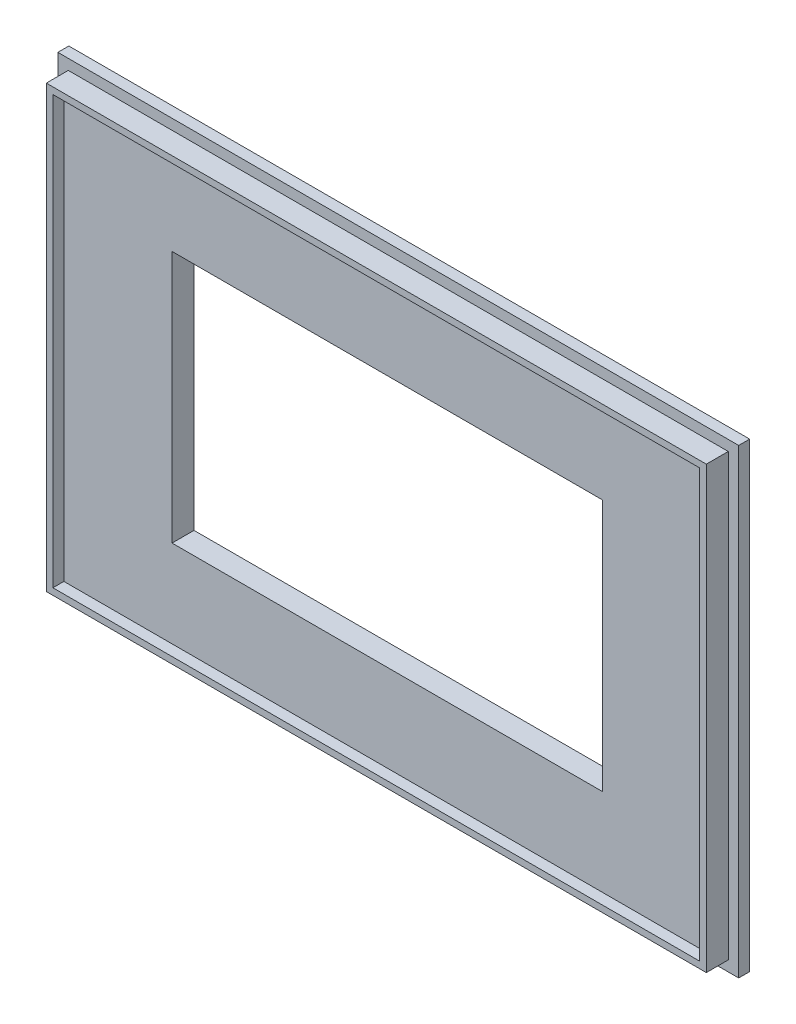
ISO-10303-21;
HEADER;
FILE_DESCRIPTION(('STEP AP214'),'2;1');
FILE_NAME('part.step','',(''),(''),'','','');
FILE_SCHEMA(('AUTOMOTIVE_DESIGN { 1 0 10303 214 1 1 1 1 }'));
ENDSEC;
DATA;
#1=APPLICATION_CONTEXT('core data for automotive mechanical design processes');
#2=APPLICATION_PROTOCOL_DEFINITION('international standard','automotive_design',2000,#1);
#3=PRODUCT_CONTEXT('',#1,'mechanical');
#4=PRODUCT('Part','Part','',(#3));
#5=PRODUCT_RELATED_PRODUCT_CATEGORY('part','',(#4));
#6=PRODUCT_DEFINITION_FORMATION('','',#4);
#7=PRODUCT_DEFINITION_CONTEXT('part definition',#1,'design');
#8=PRODUCT_DEFINITION('design','',#6,#7);
#9=PRODUCT_DEFINITION_SHAPE('','',#8);
#10=(LENGTH_UNIT() NAMED_UNIT(*) SI_UNIT(.MILLI.,.METRE.));
#11=(NAMED_UNIT(*) PLANE_ANGLE_UNIT() SI_UNIT($,.RADIAN.));
#12=(NAMED_UNIT(*) SI_UNIT($,.STERADIAN.) SOLID_ANGLE_UNIT());
#13=UNCERTAINTY_MEASURE_WITH_UNIT(LENGTH_MEASURE(1.E-05),#10,'distance_accuracy_value','');
#14=(GEOMETRIC_REPRESENTATION_CONTEXT(3) GLOBAL_UNCERTAINTY_ASSIGNED_CONTEXT((#13)) GLOBAL_UNIT_ASSIGNED_CONTEXT((#10,
#11,#12)) REPRESENTATION_CONTEXT('',''));
#15=CARTESIAN_POINT('',(0.,0.,0.));
#16=DIRECTION('',(0.,0.,1.));
#17=DIRECTION('',(1.,0.,0.));
#18=AXIS2_PLACEMENT_3D('',#15,#16,#17);
#19=CARTESIAN_POINT('',(0.,0.,5.08));
#20=DIRECTION('',(0.,0.,-1.));
#21=DIRECTION('',(-1.,0.,0.));
#22=AXIS2_PLACEMENT_3D('',#19,#20,#21);
#23=PLANE('',#22);
#24=DIRECTION('',(0.,1.,0.));
#25=VECTOR('',#24,1.);
#26=CARTESIAN_POINT('',(74.803,-49.403,5.08));
#27=LINE('',#26,#25);
#28=CARTESIAN_POINT('',(74.803,-49.403,5.08));
#29=VERTEX_POINT('',#28);
#30=CARTESIAN_POINT('',(74.803,49.403,5.08));
#31=VERTEX_POINT('',#30);
#32=EDGE_CURVE('E190',#29,#31,#27,.T.);
#33=ORIENTED_EDGE('',*,*,#32,.T.);
#34=DIRECTION('',(-1.,0.,0.));
#35=VECTOR('',#34,1.);
#36=CARTESIAN_POINT('',(-74.803,49.403,5.08));
#37=LINE('',#36,#35);
#38=CARTESIAN_POINT('',(-74.803,49.403,5.08));
#39=VERTEX_POINT('',#38);
#40=EDGE_CURVE('E193',#31,#39,#37,.T.);
#41=ORIENTED_EDGE('',*,*,#40,.T.);
#42=DIRECTION('',(0.,-1.,0.));
#43=VECTOR('',#42,1.);
#44=CARTESIAN_POINT('',(-74.803,-49.403,5.08));
#45=LINE('',#44,#43);
#46=CARTESIAN_POINT('',(-74.803,-49.403,5.08));
#47=VERTEX_POINT('',#46);
#48=EDGE_CURVE('E197',#39,#47,#45,.T.);
#49=ORIENTED_EDGE('',*,*,#48,.T.);
#50=DIRECTION('',(1.,0.,0.));
#51=VECTOR('',#50,1.);
#52=CARTESIAN_POINT('',(-74.803,-49.403,5.08));
#53=LINE('',#52,#51);
#54=EDGE_CURVE('E200',#47,#29,#53,.T.);
#55=ORIENTED_EDGE('',*,*,#54,.T.);
#56=EDGE_LOOP('',(#33,#41,#49,#55));
#57=FACE_BOUND('',#56,.T.);
#58=DIRECTION('',(0.,1.,0.));
#59=VECTOR('',#58,1.);
#60=CARTESIAN_POINT('',(49.784,-29.21,5.08));
#61=LINE('',#60,#59);
#62=CARTESIAN_POINT('',(49.784,-29.21,5.08));
#63=VERTEX_POINT('',#62);
#64=CARTESIAN_POINT('',(49.784,29.21,5.08));
#65=VERTEX_POINT('',#64);
#66=EDGE_CURVE('E158',#63,#65,#61,.T.);
#67=ORIENTED_EDGE('',*,*,#66,.F.);
#68=DIRECTION('',(1.,0.,0.));
#69=VECTOR('',#68,1.);
#70=CARTESIAN_POINT('',(-49.784,-29.21,5.08));
#71=LINE('',#70,#69);
#72=CARTESIAN_POINT('',(-49.784,-29.21,5.08));
#73=VERTEX_POINT('',#72);
#74=EDGE_CURVE('E173',#73,#63,#71,.T.);
#75=ORIENTED_EDGE('',*,*,#74,.F.);
#76=DIRECTION('',(0.,-1.,0.));
#77=VECTOR('',#76,1.);
#78=CARTESIAN_POINT('',(-49.784,-29.21,5.08));
#79=LINE('',#78,#77);
#80=CARTESIAN_POINT('',(-49.784,29.21,5.08));
#81=VERTEX_POINT('',#80);
#82=EDGE_CURVE('E54',#81,#73,#79,.T.);
#83=ORIENTED_EDGE('',*,*,#82,.F.);
#84=DIRECTION('',(-1.,0.,0.));
#85=VECTOR('',#84,1.);
#86=CARTESIAN_POINT('',(-49.784,29.21,5.08));
#87=LINE('',#86,#85);
#88=EDGE_CURVE('E181',#65,#81,#87,.T.);
#89=ORIENTED_EDGE('',*,*,#88,.F.);
#90=EDGE_LOOP('',(#67,#75,#83,#89));
#91=FACE_BOUND('',#90,.T.);
#92=ADVANCED_FACE('F39',(#57,#91),#23,.F.);
#93=CARTESIAN_POINT('',(78.74,-53.34,2.54));
#94=DIRECTION('',(-1.,0.,0.));
#95=DIRECTION('',(0.,0.,1.));
#96=AXIS2_PLACEMENT_3D('',#93,#94,#95);
#97=PLANE('',#96);
#98=DIRECTION('',(0.,1.,0.));
#99=VECTOR('',#98,1.);
#100=CARTESIAN_POINT('',(78.74,-53.34,0.));
#101=LINE('',#100,#99);
#102=CARTESIAN_POINT('',(78.74,-53.34,0.));
#103=VERTEX_POINT('',#102);
#104=CARTESIAN_POINT('',(78.74,53.34,0.));
#105=VERTEX_POINT('',#104);
#106=EDGE_CURVE('E246',#103,#105,#101,.T.);
#107=ORIENTED_EDGE('',*,*,#106,.T.);
#108=DIRECTION('',(0.,0.,-1.));
#109=VECTOR('',#108,1.);
#110=CARTESIAN_POINT('',(78.74,53.34,2.54));
#111=LINE('',#110,#109);
#112=CARTESIAN_POINT('',(78.74,53.34,2.54));
#113=VERTEX_POINT('',#112);
#114=EDGE_CURVE('E11',#113,#105,#111,.T.);
#115=ORIENTED_EDGE('',*,*,#114,.F.);
#116=DIRECTION('',(0.,1.,0.));
#117=VECTOR('',#116,1.);
#118=CARTESIAN_POINT('',(78.74,-53.34,2.54));
#119=LINE('',#118,#117);
#120=CARTESIAN_POINT('',(78.74,-53.34,2.54));
#121=VERTEX_POINT('',#120);
#122=EDGE_CURVE('E253',#121,#113,#119,.T.);
#123=ORIENTED_EDGE('',*,*,#122,.F.);
#124=DIRECTION('',(0.,0.,-1.));
#125=VECTOR('',#124,1.);
#126=CARTESIAN_POINT('',(78.74,-53.34,2.54));
#127=LINE('',#126,#125);
#128=EDGE_CURVE('E263',#121,#103,#127,.T.);
#129=ORIENTED_EDGE('',*,*,#128,.T.);
#130=EDGE_LOOP('',(#107,#115,#123,#129));
#131=FACE_BOUND('',#130,.T.);
#132=ADVANCED_FACE('F41',(#131),#97,.F.);
#133=CARTESIAN_POINT('',(-78.74,53.34,2.54));
#134=DIRECTION('',(0.,-1.,0.));
#135=DIRECTION('',(0.,0.,-1.));
#136=AXIS2_PLACEMENT_3D('',#133,#134,#135);
#137=PLANE('',#136);
#138=DIRECTION('',(-1.,0.,0.));
#139=VECTOR('',#138,1.);
#140=CARTESIAN_POINT('',(-78.74,53.34,0.));
#141=LINE('',#140,#139);
#142=CARTESIAN_POINT('',(-78.74,53.34,0.));
#143=VERTEX_POINT('',#142);
#144=EDGE_CURVE('E266',#105,#143,#141,.T.);
#145=ORIENTED_EDGE('',*,*,#144,.T.);
#146=DIRECTION('',(0.,0.,-1.));
#147=VECTOR('',#146,1.);
#148=CARTESIAN_POINT('',(-78.74,53.34,2.54));
#149=LINE('',#148,#147);
#150=CARTESIAN_POINT('',(-78.74,53.34,2.54));
#151=VERTEX_POINT('',#150);
#152=EDGE_CURVE('E47',#151,#143,#149,.T.);
#153=ORIENTED_EDGE('',*,*,#152,.F.);
#154=DIRECTION('',(-1.,0.,0.));
#155=VECTOR('',#154,1.);
#156=CARTESIAN_POINT('',(-78.74,53.34,2.54));
#157=LINE('',#156,#155);
#158=EDGE_CURVE('E256',#113,#151,#157,.T.);
#159=ORIENTED_EDGE('',*,*,#158,.F.);
#160=ORIENTED_EDGE('',*,*,#114,.T.);
#161=EDGE_LOOP('',(#145,#153,#159,#160));
#162=FACE_BOUND('',#161,.T.);
#163=ADVANCED_FACE('F294',(#162),#137,.F.);
#164=CARTESIAN_POINT('',(-78.74,-53.34,2.54));
#165=DIRECTION('',(1.,0.,0.));
#166=DIRECTION('',(0.,0.,-1.));
#167=AXIS2_PLACEMENT_3D('',#164,#165,#166);
#168=PLANE('',#167);
#169=DIRECTION('',(0.,-1.,0.));
#170=VECTOR('',#169,1.);
#171=CARTESIAN_POINT('',(-78.74,-53.34,0.));
#172=LINE('',#171,#170);
#173=CARTESIAN_POINT('',(-78.74,-53.34,0.));
#174=VERTEX_POINT('',#173);
#175=EDGE_CURVE('E268',#143,#174,#172,.T.);
#176=ORIENTED_EDGE('',*,*,#175,.T.);
#177=DIRECTION('',(0.,0.,-1.));
#178=VECTOR('',#177,1.);
#179=CARTESIAN_POINT('',(-78.74,-53.34,2.54));
#180=LINE('',#179,#178);
#181=CARTESIAN_POINT('',(-78.74,-53.34,2.54));
#182=VERTEX_POINT('',#181);
#183=EDGE_CURVE('E273',#182,#174,#180,.T.);
#184=ORIENTED_EDGE('',*,*,#183,.F.);
#185=DIRECTION('',(0.,-1.,0.));
#186=VECTOR('',#185,1.);
#187=CARTESIAN_POINT('',(-78.74,-53.34,2.54));
#188=LINE('',#187,#186);
#189=EDGE_CURVE('E259',#151,#182,#188,.T.);
#190=ORIENTED_EDGE('',*,*,#189,.F.);
#191=ORIENTED_EDGE('',*,*,#152,.T.);
#192=EDGE_LOOP('',(#176,#184,#190,#191));
#193=FACE_BOUND('',#192,.T.);
#194=ADVANCED_FACE('F280',(#193),#168,.F.);
#195=CARTESIAN_POINT('',(-78.74,-53.34,2.54));
#196=DIRECTION('',(0.,1.,0.));
#197=DIRECTION('',(0.,0.,1.));
#198=AXIS2_PLACEMENT_3D('',#195,#196,#197);
#199=PLANE('',#198);
#200=DIRECTION('',(1.,0.,0.));
#201=VECTOR('',#200,1.);
#202=CARTESIAN_POINT('',(-78.74,-53.34,0.));
#203=LINE('',#202,#201);
#204=EDGE_CURVE('E257',#174,#103,#203,.T.);
#205=ORIENTED_EDGE('',*,*,#204,.T.);
#206=ORIENTED_EDGE('',*,*,#128,.F.);
#207=DIRECTION('',(1.,0.,0.));
#208=VECTOR('',#207,1.);
#209=CARTESIAN_POINT('',(-78.74,-53.34,2.54));
#210=LINE('',#209,#208);
#211=EDGE_CURVE('E261',#182,#121,#210,.T.);
#212=ORIENTED_EDGE('',*,*,#211,.F.);
#213=ORIENTED_EDGE('',*,*,#183,.T.);
#214=EDGE_LOOP('',(#205,#206,#212,#213));
#215=FACE_BOUND('',#214,.T.);
#216=ADVANCED_FACE('F287',(#215),#199,.F.);
#217=CARTESIAN_POINT('',(0.,0.,2.54));
#218=DIRECTION('',(0.,0.,-1.));
#219=DIRECTION('',(-1.,0.,0.));
#220=AXIS2_PLACEMENT_3D('',#217,#218,#219);
#221=PLANE('',#220);
#222=DIRECTION('',(0.,1.,0.));
#223=VECTOR('',#222,1.);
#224=CARTESIAN_POINT('',(-76.327,-50.927,2.54));
#225=LINE('',#224,#223);
#226=CARTESIAN_POINT('',(-76.327,-50.927,2.54));
#227=VERTEX_POINT('',#226);
#228=CARTESIAN_POINT('',(-76.327,50.927,2.54));
#229=VERTEX_POINT('',#228);
#230=EDGE_CURVE('E226',#227,#229,#225,.T.);
#231=ORIENTED_EDGE('',*,*,#230,.T.);
#232=DIRECTION('',(1.,0.,0.));
#233=VECTOR('',#232,1.);
#234=CARTESIAN_POINT('',(-76.327,50.927,2.54));
#235=LINE('',#234,#233);
#236=CARTESIAN_POINT('',(76.327,50.927,2.54));
#237=VERTEX_POINT('',#236);
#238=EDGE_CURVE('E215',#229,#237,#235,.T.);
#239=ORIENTED_EDGE('',*,*,#238,.T.);
#240=DIRECTION('',(0.,1.,0.));
#241=VECTOR('',#240,1.);
#242=CARTESIAN_POINT('',(76.327,-50.927,2.54));
#243=LINE('',#242,#241);
#244=CARTESIAN_POINT('',(76.327,-50.927,2.54));
#245=VERTEX_POINT('',#244);
#246=EDGE_CURVE('E236',#245,#237,#243,.T.);
#247=ORIENTED_EDGE('',*,*,#246,.F.);
#248=DIRECTION('',(1.,0.,0.));
#249=VECTOR('',#248,1.);
#250=CARTESIAN_POINT('',(-76.327,-50.927,2.54));
#251=LINE('',#250,#249);
#252=EDGE_CURVE('E239',#227,#245,#251,.T.);
#253=ORIENTED_EDGE('',*,*,#252,.F.);
#254=EDGE_LOOP('',(#231,#239,#247,#253));
#255=FACE_BOUND('',#254,.T.);
#256=ORIENTED_EDGE('',*,*,#122,.T.);
#257=ORIENTED_EDGE('',*,*,#158,.T.);
#258=ORIENTED_EDGE('',*,*,#189,.T.);
#259=ORIENTED_EDGE('',*,*,#211,.T.);
#260=EDGE_LOOP('',(#256,#257,#258,#259));
#261=FACE_BOUND('',#260,.T.);
#262=ADVANCED_FACE('F293',(#255,#261),#221,.F.);
#263=CARTESIAN_POINT('',(0.,0.,0.));
#264=DIRECTION('',(0.,0.,-1.));
#265=DIRECTION('',(-1.,0.,0.));
#266=AXIS2_PLACEMENT_3D('',#263,#264,#265);
#267=PLANE('',#266);
#268=DIRECTION('',(0.,1.,0.));
#269=VECTOR('',#268,1.);
#270=CARTESIAN_POINT('',(49.784,-29.21,0.));
#271=LINE('',#270,#269);
#272=CARTESIAN_POINT('',(49.784,-29.21,0.));
#273=VERTEX_POINT('',#272);
#274=CARTESIAN_POINT('',(49.784,29.21,0.));
#275=VERTEX_POINT('',#274);
#276=EDGE_CURVE('E155',#273,#275,#271,.T.);
#277=ORIENTED_EDGE('',*,*,#276,.T.);
#278=DIRECTION('',(-1.,0.,0.));
#279=VECTOR('',#278,1.);
#280=CARTESIAN_POINT('',(-49.784,29.21,0.));
#281=LINE('',#280,#279);
#282=CARTESIAN_POINT('',(-49.784,29.21,0.));
#283=VERTEX_POINT('',#282);
#284=EDGE_CURVE('E166',#275,#283,#281,.T.);
#285=ORIENTED_EDGE('',*,*,#284,.T.);
#286=DIRECTION('',(0.,-1.,0.));
#287=VECTOR('',#286,1.);
#288=CARTESIAN_POINT('',(-49.784,-29.21,0.));
#289=LINE('',#288,#287);
#290=CARTESIAN_POINT('',(-49.784,-29.21,0.));
#291=VERTEX_POINT('',#290);
#292=EDGE_CURVE('E59',#283,#291,#289,.T.);
#293=ORIENTED_EDGE('',*,*,#292,.T.);
#294=DIRECTION('',(1.,0.,0.));
#295=VECTOR('',#294,1.);
#296=CARTESIAN_POINT('',(-49.784,-29.21,0.));
#297=LINE('',#296,#295);
#298=EDGE_CURVE('E163',#291,#273,#297,.T.);
#299=ORIENTED_EDGE('',*,*,#298,.T.);
#300=EDGE_LOOP('',(#277,#285,#293,#299));
#301=FACE_BOUND('',#300,.T.);
#302=ORIENTED_EDGE('',*,*,#106,.F.);
#303=ORIENTED_EDGE('',*,*,#204,.F.);
#304=ORIENTED_EDGE('',*,*,#175,.F.);
#305=ORIENTED_EDGE('',*,*,#144,.F.);
#306=EDGE_LOOP('',(#302,#303,#304,#305));
#307=FACE_BOUND('',#306,.T.);
#308=ADVANCED_FACE('F170',(#301,#307),#267,.T.);
#309=CARTESIAN_POINT('',(-76.327,50.927,7.62));
#310=DIRECTION('',(0.,1.,0.));
#311=DIRECTION('',(0.,0.,1.));
#312=AXIS2_PLACEMENT_3D('',#309,#310,#311);
#313=PLANE('',#312);
#314=ORIENTED_EDGE('',*,*,#238,.F.);
#315=DIRECTION('',(0.,0.,-1.));
#316=VECTOR('',#315,1.);
#317=CARTESIAN_POINT('',(-76.327,50.927,7.62));
#318=LINE('',#317,#316);
#319=CARTESIAN_POINT('',(-76.327,50.927,7.62));
#320=VERTEX_POINT('',#319);
#321=EDGE_CURVE('E243',#320,#229,#318,.T.);
#322=ORIENTED_EDGE('',*,*,#321,.F.);
#323=DIRECTION('',(1.,0.,0.));
#324=VECTOR('',#323,1.);
#325=CARTESIAN_POINT('',(-76.327,50.927,7.62));
#326=LINE('',#325,#324);
#327=CARTESIAN_POINT('',(76.327,50.927,7.62));
#328=VERTEX_POINT('',#327);
#329=EDGE_CURVE('E222',#320,#328,#326,.T.);
#330=ORIENTED_EDGE('',*,*,#329,.T.);
#331=DIRECTION('',(0.,0.,-1.));
#332=VECTOR('',#331,1.);
#333=CARTESIAN_POINT('',(76.327,50.927,7.62));
#334=LINE('',#333,#332);
#335=EDGE_CURVE('E233',#328,#237,#334,.T.);
#336=ORIENTED_EDGE('',*,*,#335,.T.);
#337=EDGE_LOOP('',(#314,#322,#330,#336));
#338=FACE_BOUND('',#337,.T.);
#339=ADVANCED_FACE('F335',(#338),#313,.T.);
#340=CARTESIAN_POINT('',(-76.327,-50.927,7.62));
#341=DIRECTION('',(-1.,0.,0.));
#342=DIRECTION('',(0.,0.,1.));
#343=AXIS2_PLACEMENT_3D('',#340,#341,#342);
#344=PLANE('',#343);
#345=ORIENTED_EDGE('',*,*,#230,.F.);
#346=DIRECTION('',(0.,0.,-1.));
#347=VECTOR('',#346,1.);
#348=CARTESIAN_POINT('',(-76.327,-50.927,7.62));
#349=LINE('',#348,#347);
#350=CARTESIAN_POINT('',(-76.327,-50.927,7.62));
#351=VERTEX_POINT('',#350);
#352=EDGE_CURVE('E247',#351,#227,#349,.T.);
#353=ORIENTED_EDGE('',*,*,#352,.F.);
#354=DIRECTION('',(0.,1.,0.));
#355=VECTOR('',#354,1.);
#356=CARTESIAN_POINT('',(-76.327,-50.927,7.62));
#357=LINE('',#356,#355);
#358=EDGE_CURVE('E230',#351,#320,#357,.T.);
#359=ORIENTED_EDGE('',*,*,#358,.T.);
#360=ORIENTED_EDGE('',*,*,#321,.T.);
#361=EDGE_LOOP('',(#345,#353,#359,#360));
#362=FACE_BOUND('',#361,.T.);
#363=ADVANCED_FACE('F331',(#362),#344,.T.);
#364=CARTESIAN_POINT('',(-76.327,-50.927,7.62));
#365=DIRECTION('',(0.,1.,0.));
#366=DIRECTION('',(0.,0.,1.));
#367=AXIS2_PLACEMENT_3D('',#364,#365,#366);
#368=PLANE('',#367);
#369=ORIENTED_EDGE('',*,*,#252,.T.);
#370=DIRECTION('',(0.,0.,-1.));
#371=VECTOR('',#370,1.);
#372=CARTESIAN_POINT('',(76.327,-50.927,7.62));
#373=LINE('',#372,#371);
#374=CARTESIAN_POINT('',(76.327,-50.927,7.62));
#375=VERTEX_POINT('',#374);
#376=EDGE_CURVE('E249',#375,#245,#373,.T.);
#377=ORIENTED_EDGE('',*,*,#376,.F.);
#378=DIRECTION('',(1.,0.,0.));
#379=VECTOR('',#378,1.);
#380=CARTESIAN_POINT('',(-76.327,-50.927,7.62));
#381=LINE('',#380,#379);
#382=EDGE_CURVE('E228',#351,#375,#381,.T.);
#383=ORIENTED_EDGE('',*,*,#382,.F.);
#384=ORIENTED_EDGE('',*,*,#352,.T.);
#385=EDGE_LOOP('',(#369,#377,#383,#384));
#386=FACE_BOUND('',#385,.T.);
#387=ADVANCED_FACE('F334',(#386),#368,.F.);
#388=CARTESIAN_POINT('',(76.327,-50.927,7.62));
#389=DIRECTION('',(-1.,0.,0.));
#390=DIRECTION('',(0.,0.,1.));
#391=AXIS2_PLACEMENT_3D('',#388,#389,#390);
#392=PLANE('',#391);
#393=ORIENTED_EDGE('',*,*,#246,.T.);
#394=ORIENTED_EDGE('',*,*,#335,.F.);
#395=DIRECTION('',(0.,1.,0.));
#396=VECTOR('',#395,1.);
#397=CARTESIAN_POINT('',(76.327,-50.927,7.62));
#398=LINE('',#397,#396);
#399=EDGE_CURVE('E225',#375,#328,#398,.T.);
#400=ORIENTED_EDGE('',*,*,#399,.F.);
#401=ORIENTED_EDGE('',*,*,#376,.T.);
#402=EDGE_LOOP('',(#393,#394,#400,#401));
#403=FACE_BOUND('',#402,.T.);
#404=ADVANCED_FACE('F329',(#403),#392,.F.);
#405=CARTESIAN_POINT('',(0.,0.,7.62));
#406=DIRECTION('',(0.,0.,1.));
#407=DIRECTION('',(1.,0.,0.));
#408=AXIS2_PLACEMENT_3D('',#405,#406,#407);
#409=PLANE('',#408);
#410=DIRECTION('',(0.,1.,0.));
#411=VECTOR('',#410,1.);
#412=CARTESIAN_POINT('',(74.803,-49.403,7.62));
#413=LINE('',#412,#411);
#414=CARTESIAN_POINT('',(74.803,-49.403,7.62));
#415=VERTEX_POINT('',#414);
#416=CARTESIAN_POINT('',(74.803,49.403,7.62));
#417=VERTEX_POINT('',#416);
#418=EDGE_CURVE('E186',#415,#417,#413,.T.);
#419=ORIENTED_EDGE('',*,*,#418,.F.);
#420=DIRECTION('',(1.,0.,0.));
#421=VECTOR('',#420,1.);
#422=CARTESIAN_POINT('',(-74.803,-49.403,7.62));
#423=LINE('',#422,#421);
#424=CARTESIAN_POINT('',(-74.803,-49.403,7.62));
#425=VERTEX_POINT('',#424);
#426=EDGE_CURVE('E194',#425,#415,#423,.T.);
#427=ORIENTED_EDGE('',*,*,#426,.F.);
#428=DIRECTION('',(0.,-1.,0.));
#429=VECTOR('',#428,1.);
#430=CARTESIAN_POINT('',(-74.803,-49.403,7.62));
#431=LINE('',#430,#429);
#432=CARTESIAN_POINT('',(-74.803,49.403,7.62));
#433=VERTEX_POINT('',#432);
#434=EDGE_CURVE('E208',#433,#425,#431,.T.);
#435=ORIENTED_EDGE('',*,*,#434,.F.);
#436=DIRECTION('',(-1.,0.,0.));
#437=VECTOR('',#436,1.);
#438=CARTESIAN_POINT('',(-74.803,49.403,7.62));
#439=LINE('',#438,#437);
#440=EDGE_CURVE('E205',#417,#433,#439,.T.);
#441=ORIENTED_EDGE('',*,*,#440,.F.);
#442=EDGE_LOOP('',(#419,#427,#435,#441));
#443=FACE_BOUND('',#442,.T.);
#444=ORIENTED_EDGE('',*,*,#329,.F.);
#445=ORIENTED_EDGE('',*,*,#358,.F.);
#446=ORIENTED_EDGE('',*,*,#382,.T.);
#447=ORIENTED_EDGE('',*,*,#399,.T.);
#448=EDGE_LOOP('',(#444,#445,#446,#447));
#449=FACE_BOUND('',#448,.T.);
#450=ADVANCED_FACE('F325',(#443,#449),#409,.T.);
#451=CARTESIAN_POINT('',(74.803,-49.403,5.08));
#452=DIRECTION('',(1.,0.,0.));
#453=DIRECTION('',(0.,0.,-1.));
#454=AXIS2_PLACEMENT_3D('',#451,#452,#453);
#455=PLANE('',#454);
#456=ORIENTED_EDGE('',*,*,#418,.T.);
#457=DIRECTION('',(0.,0.,1.));
#458=VECTOR('',#457,1.);
#459=CARTESIAN_POINT('',(74.803,49.403,5.08));
#460=LINE('',#459,#458);
#461=EDGE_CURVE('E203',#31,#417,#460,.T.);
#462=ORIENTED_EDGE('',*,*,#461,.F.);
#463=ORIENTED_EDGE('',*,*,#32,.F.);
#464=DIRECTION('',(0.,0.,1.));
#465=VECTOR('',#464,1.);
#466=CARTESIAN_POINT('',(74.803,-49.403,5.08));
#467=LINE('',#466,#465);
#468=EDGE_CURVE('E213',#29,#415,#467,.T.);
#469=ORIENTED_EDGE('',*,*,#468,.T.);
#470=EDGE_LOOP('',(#456,#462,#463,#469));
#471=FACE_BOUND('',#470,.T.);
#472=ADVANCED_FACE('F314',(#471),#455,.F.);
#473=CARTESIAN_POINT('',(-74.803,-49.403,5.08));
#474=DIRECTION('',(0.,-1.,0.));
#475=DIRECTION('',(0.,0.,-1.));
#476=AXIS2_PLACEMENT_3D('',#473,#474,#475);
#477=PLANE('',#476);
#478=ORIENTED_EDGE('',*,*,#426,.T.);
#479=ORIENTED_EDGE('',*,*,#468,.F.);
#480=ORIENTED_EDGE('',*,*,#54,.F.);
#481=DIRECTION('',(0.,0.,1.));
#482=VECTOR('',#481,1.);
#483=CARTESIAN_POINT('',(-74.803,-49.403,5.08));
#484=LINE('',#483,#482);
#485=EDGE_CURVE('E216',#47,#425,#484,.T.);
#486=ORIENTED_EDGE('',*,*,#485,.T.);
#487=EDGE_LOOP('',(#478,#479,#480,#486));
#488=FACE_BOUND('',#487,.T.);
#489=ADVANCED_FACE('F310',(#488),#477,.F.);
#490=CARTESIAN_POINT('',(-74.803,-49.403,5.08));
#491=DIRECTION('',(-1.,0.,0.));
#492=DIRECTION('',(0.,0.,1.));
#493=AXIS2_PLACEMENT_3D('',#490,#491,#492);
#494=PLANE('',#493);
#495=ORIENTED_EDGE('',*,*,#434,.T.);
#496=ORIENTED_EDGE('',*,*,#485,.F.);
#497=ORIENTED_EDGE('',*,*,#48,.F.);
#498=DIRECTION('',(0.,0.,1.));
#499=VECTOR('',#498,1.);
#500=CARTESIAN_POINT('',(-74.803,49.403,5.08));
#501=LINE('',#500,#499);
#502=EDGE_CURVE('E218',#39,#433,#501,.T.);
#503=ORIENTED_EDGE('',*,*,#502,.T.);
#504=EDGE_LOOP('',(#495,#496,#497,#503));
#505=FACE_BOUND('',#504,.T.);
#506=ADVANCED_FACE('F313',(#505),#494,.F.);
#507=CARTESIAN_POINT('',(-74.803,49.403,5.08));
#508=DIRECTION('',(0.,1.,0.));
#509=DIRECTION('',(0.,0.,1.));
#510=AXIS2_PLACEMENT_3D('',#507,#508,#509);
#511=PLANE('',#510);
#512=ORIENTED_EDGE('',*,*,#440,.T.);
#513=ORIENTED_EDGE('',*,*,#502,.F.);
#514=ORIENTED_EDGE('',*,*,#40,.F.);
#515=ORIENTED_EDGE('',*,*,#461,.T.);
#516=EDGE_LOOP('',(#512,#513,#514,#515));
#517=FACE_BOUND('',#516,.T.);
#518=ADVANCED_FACE('F318',(#517),#511,.F.);
#519=CARTESIAN_POINT('',(49.784,-29.21,0.));
#520=DIRECTION('',(1.,0.,0.));
#521=DIRECTION('',(0.,0.,-1.));
#522=AXIS2_PLACEMENT_3D('',#519,#520,#521);
#523=PLANE('',#522);
#524=ORIENTED_EDGE('',*,*,#66,.T.);
#525=DIRECTION('',(0.,0.,1.));
#526=VECTOR('',#525,1.);
#527=CARTESIAN_POINT('',(49.784,29.21,0.));
#528=LINE('',#527,#526);
#529=EDGE_CURVE('E151',#275,#65,#528,.T.);
#530=ORIENTED_EDGE('',*,*,#529,.F.);
#531=ORIENTED_EDGE('',*,*,#276,.F.);
#532=DIRECTION('',(0.,0.,1.));
#533=VECTOR('',#532,1.);
#534=CARTESIAN_POINT('',(49.784,-29.21,0.));
#535=LINE('',#534,#533);
#536=EDGE_CURVE('E184',#273,#63,#535,.T.);
#537=ORIENTED_EDGE('',*,*,#536,.T.);
#538=EDGE_LOOP('',(#524,#530,#531,#537));
#539=FACE_BOUND('',#538,.T.);
#540=ADVANCED_FACE('F153',(#539),#523,.F.);
#541=CARTESIAN_POINT('',(-49.784,-29.21,0.));
#542=DIRECTION('',(0.,-1.,0.));
#543=DIRECTION('',(0.,0.,-1.));
#544=AXIS2_PLACEMENT_3D('',#541,#542,#543);
#545=PLANE('',#544);
#546=ORIENTED_EDGE('',*,*,#74,.T.);
#547=ORIENTED_EDGE('',*,*,#536,.F.);
#548=ORIENTED_EDGE('',*,*,#298,.F.);
#549=DIRECTION('',(0.,0.,1.));
#550=VECTOR('',#549,1.);
#551=CARTESIAN_POINT('',(-49.784,-29.21,0.));
#552=LINE('',#551,#550);
#553=EDGE_CURVE('E187',#291,#73,#552,.T.);
#554=ORIENTED_EDGE('',*,*,#553,.T.);
#555=EDGE_LOOP('',(#546,#547,#548,#554));
#556=FACE_BOUND('',#555,.T.);
#557=ADVANCED_FACE('F406',(#556),#545,.F.);
#558=CARTESIAN_POINT('',(-49.784,-29.21,0.));
#559=DIRECTION('',(-1.,0.,0.));
#560=DIRECTION('',(0.,0.,1.));
#561=AXIS2_PLACEMENT_3D('',#558,#559,#560);
#562=PLANE('',#561);
#563=ORIENTED_EDGE('',*,*,#82,.T.);
#564=ORIENTED_EDGE('',*,*,#553,.F.);
#565=ORIENTED_EDGE('',*,*,#292,.F.);
#566=DIRECTION('',(0.,0.,1.));
#567=VECTOR('',#566,1.);
#568=CARTESIAN_POINT('',(-49.784,29.21,0.));
#569=LINE('',#568,#567);
#570=EDGE_CURVE('E162',#283,#81,#569,.T.);
#571=ORIENTED_EDGE('',*,*,#570,.T.);
#572=EDGE_LOOP('',(#563,#564,#565,#571));
#573=FACE_BOUND('',#572,.T.);
#574=ADVANCED_FACE('F412',(#573),#562,.F.);
#575=CARTESIAN_POINT('',(-49.784,29.21,0.));
#576=DIRECTION('',(0.,1.,0.));
#577=DIRECTION('',(0.,0.,1.));
#578=AXIS2_PLACEMENT_3D('',#575,#576,#577);
#579=PLANE('',#578);
#580=ORIENTED_EDGE('',*,*,#88,.T.);
#581=ORIENTED_EDGE('',*,*,#570,.F.);
#582=ORIENTED_EDGE('',*,*,#284,.F.);
#583=ORIENTED_EDGE('',*,*,#529,.T.);
#584=EDGE_LOOP('',(#580,#581,#582,#583));
#585=FACE_BOUND('',#584,.T.);
#586=ADVANCED_FACE('F167',(#585),#579,.F.);
#587=CLOSED_SHELL('',(#92,#132,#163,#194,#216,#262,#308,#339,#363,#387,#404,#450,#472,#489,#506,
#518,#540,#557,#574,#586));
#588=MANIFOLD_SOLID_BREP('B2',#587);
#589=ADVANCED_BREP_SHAPE_REPRESENTATION('',(#18,#588),#14);
#590=SHAPE_DEFINITION_REPRESENTATION(#9,#589);
ENDSEC;
END-ISO-10303-21;
